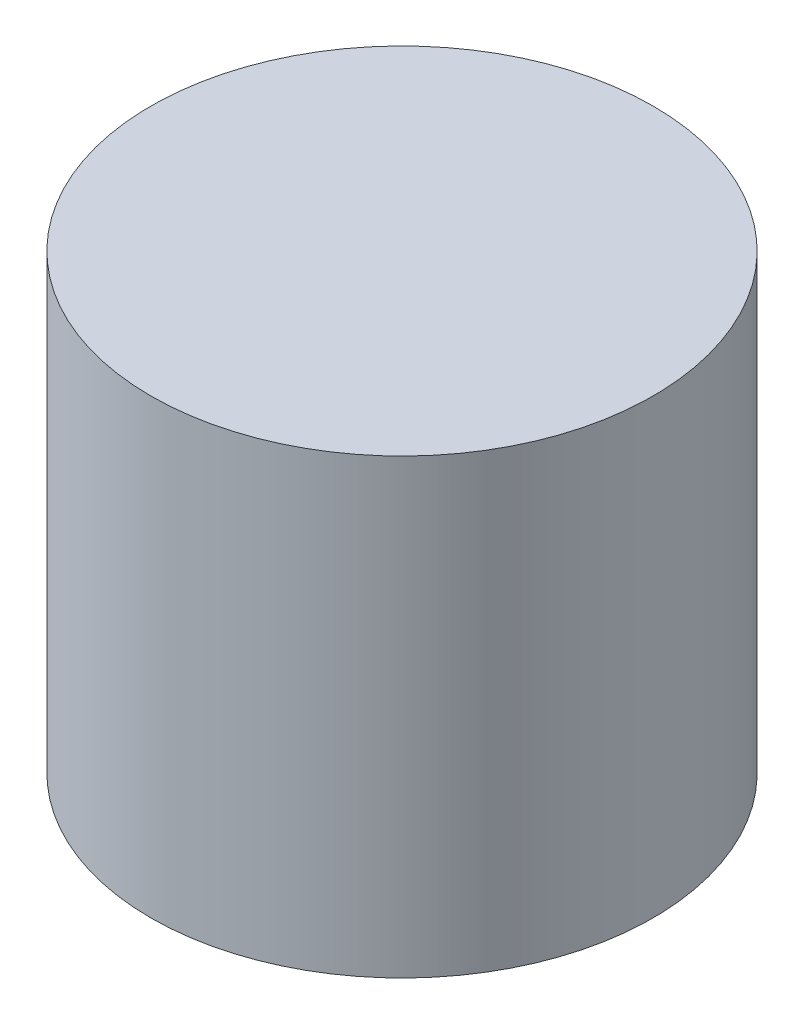
ISO-10303-21;
HEADER;
FILE_DESCRIPTION(('STEP AP214'),'2;1');
FILE_NAME('part.step','',(''),(''),'','','');
FILE_SCHEMA(('AUTOMOTIVE_DESIGN { 1 0 10303 214 1 1 1 1 }'));
ENDSEC;
DATA;
#1=APPLICATION_CONTEXT('core data for automotive mechanical design processes');
#2=APPLICATION_PROTOCOL_DEFINITION('international standard','automotive_design',2000,#1);
#3=PRODUCT_CONTEXT('',#1,'mechanical');
#4=PRODUCT('Part','Part','',(#3));
#5=PRODUCT_RELATED_PRODUCT_CATEGORY('part','',(#4));
#6=PRODUCT_DEFINITION_FORMATION('','',#4);
#7=PRODUCT_DEFINITION_CONTEXT('part definition',#1,'design');
#8=PRODUCT_DEFINITION('design','',#6,#7);
#9=PRODUCT_DEFINITION_SHAPE('','',#8);
#10=(LENGTH_UNIT() NAMED_UNIT(*) SI_UNIT(.MILLI.,.METRE.));
#11=(NAMED_UNIT(*) PLANE_ANGLE_UNIT() SI_UNIT($,.RADIAN.));
#12=(NAMED_UNIT(*) SI_UNIT($,.STERADIAN.) SOLID_ANGLE_UNIT());
#13=UNCERTAINTY_MEASURE_WITH_UNIT(LENGTH_MEASURE(1.E-05),#10,'distance_accuracy_value','');
#14=(GEOMETRIC_REPRESENTATION_CONTEXT(3) GLOBAL_UNCERTAINTY_ASSIGNED_CONTEXT((#13)) GLOBAL_UNIT_ASSIGNED_CONTEXT((#10,
#11,#12)) REPRESENTATION_CONTEXT('',''));
#15=CARTESIAN_POINT('',(0.,0.,0.));
#16=DIRECTION('',(0.,0.,1.));
#17=DIRECTION('',(1.,0.,0.));
#18=AXIS2_PLACEMENT_3D('',#15,#16,#17);
#19=CARTESIAN_POINT('',(0.,0.,0.));
#20=DIRECTION('',(0.,-1.,0.));
#21=DIRECTION('',(0.,0.,-1.));
#22=AXIS2_PLACEMENT_3D('',#19,#20,#21);
#23=PLANE('',#22);
#24=CARTESIAN_POINT('',(0.,0.,0.));
#25=DIRECTION('',(0.,-1.,0.));
#26=DIRECTION('',(0.,0.,-1.));
#27=AXIS2_PLACEMENT_3D('',#24,#25,#26);
#28=CIRCLE('',#27,20.);
#29=CARTESIAN_POINT('',(0.,0.,-20.));
#30=VERTEX_POINT('',#29);
#31=EDGE_CURVE('E10',#30,#30,#28,.T.);
#32=ORIENTED_EDGE('',*,*,#31,.T.);
#33=EDGE_LOOP('',(#32));
#34=FACE_BOUND('',#33,.T.);
#35=ADVANCED_FACE('F32',(#34),#23,.T.);
#36=CARTESIAN_POINT('',(0.,0.,0.));
#37=DIRECTION('',(0.,-1.,0.));
#38=DIRECTION('',(0.,0.,-1.));
#39=AXIS2_PLACEMENT_3D('',#36,#37,#38);
#40=CYLINDRICAL_SURFACE('',#39,20.);
#41=CARTESIAN_POINT('',(0.,36.,0.));
#42=DIRECTION('',(0.,-1.,0.));
#43=DIRECTION('',(0.,0.,-1.));
#44=AXIS2_PLACEMENT_3D('',#41,#42,#43);
#45=CIRCLE('',#44,20.);
#46=CARTESIAN_POINT('',(0.,36.,-20.));
#47=VERTEX_POINT('',#46);
#48=EDGE_CURVE('E38',#47,#47,#45,.T.);
#49=ORIENTED_EDGE('',*,*,#48,.T.);
#50=EDGE_LOOP('',(#49));
#51=FACE_BOUND('',#50,.T.);
#52=ORIENTED_EDGE('',*,*,#31,.F.);
#53=EDGE_LOOP('',(#52));
#54=FACE_BOUND('',#53,.T.);
#55=ADVANCED_FACE('F44',(#51,#54),#40,.T.);
#56=CARTESIAN_POINT('',(20.,36.,0.));
#57=DIRECTION('',(0.,1.,0.));
#58=DIRECTION('',(0.,0.,1.));
#59=AXIS2_PLACEMENT_3D('',#56,#57,#58);
#60=PLANE('',#59);
#61=ORIENTED_EDGE('',*,*,#48,.F.);
#62=EDGE_LOOP('',(#61));
#63=FACE_BOUND('',#62,.T.);
#64=ADVANCED_FACE('F47',(#63),#60,.T.);
#65=CLOSED_SHELL('',(#35,#55,#64));
#66=MANIFOLD_SOLID_BREP('B2',#65);
#67=ADVANCED_BREP_SHAPE_REPRESENTATION('',(#18,#66),#14);
#68=SHAPE_DEFINITION_REPRESENTATION(#9,#67);
ENDSEC;
END-ISO-10303-21;
